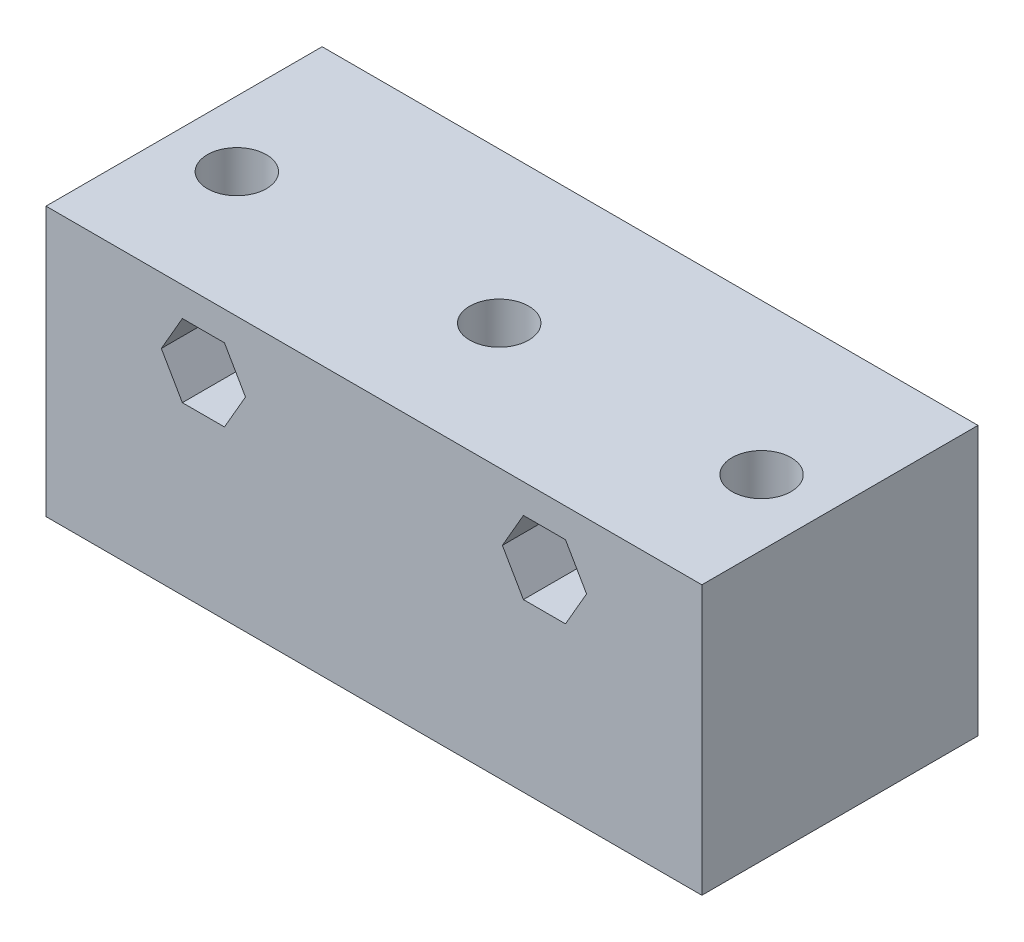
ISO-10303-21;
HEADER;
FILE_DESCRIPTION(('STEP AP214'),'2;1');
FILE_NAME('part.step','',(''),(''),'','','');
FILE_SCHEMA(('AUTOMOTIVE_DESIGN { 1 0 10303 214 1 1 1 1 }'));
ENDSEC;
DATA;
#1=APPLICATION_CONTEXT('core data for automotive mechanical design processes');
#2=APPLICATION_PROTOCOL_DEFINITION('international standard','automotive_design',2000,#1);
#3=PRODUCT_CONTEXT('',#1,'mechanical');
#4=PRODUCT('Part','Part','',(#3));
#5=PRODUCT_RELATED_PRODUCT_CATEGORY('part','',(#4));
#6=PRODUCT_DEFINITION_FORMATION('','',#4);
#7=PRODUCT_DEFINITION_CONTEXT('part definition',#1,'design');
#8=PRODUCT_DEFINITION('design','',#6,#7);
#9=PRODUCT_DEFINITION_SHAPE('','',#8);
#10=(LENGTH_UNIT() NAMED_UNIT(*) SI_UNIT(.MILLI.,.METRE.));
#11=(NAMED_UNIT(*) PLANE_ANGLE_UNIT() SI_UNIT($,.RADIAN.));
#12=(NAMED_UNIT(*) SI_UNIT($,.STERADIAN.) SOLID_ANGLE_UNIT());
#13=UNCERTAINTY_MEASURE_WITH_UNIT(LENGTH_MEASURE(1.E-05),#10,'distance_accuracy_value','');
#14=(GEOMETRIC_REPRESENTATION_CONTEXT(3) GLOBAL_UNCERTAINTY_ASSIGNED_CONTEXT((#13)) GLOBAL_UNIT_ASSIGNED_CONTEXT((#10,
#11,#12)) REPRESENTATION_CONTEXT('',''));
#15=CARTESIAN_POINT('',(0.,0.,0.));
#16=DIRECTION('',(0.,0.,1.));
#17=DIRECTION('',(1.,0.,0.));
#18=AXIS2_PLACEMENT_3D('',#15,#16,#17);
#19=CARTESIAN_POINT('',(8.85801933130078,5.11417984541329,42.1));
#20=DIRECTION('',(-0.866025403784444,-0.499999999999991,0.));
#21=DIRECTION('',(0.499999999999991,-0.866025403784444,0.));
#22=AXIS2_PLACEMENT_3D('',#19,#20,#21);
#23=PLANE('',#22);
#24=DIRECTION('',(0.,0.,-1.));
#25=VECTOR('',#24,1.);
#26=CARTESIAN_POINT('',(20.7920975668151,-15.55625,42.1));
#27=LINE('',#26,#25);
#28=CARTESIAN_POINT('',(20.7920975668151,-15.55625,42.1));
#29=VERTEX_POINT('',#28);
#30=CARTESIAN_POINT('',(20.7920975668151,-15.55625,10.));
#31=VERTEX_POINT('',#30);
#32=EDGE_CURVE('E277',#29,#31,#27,.T.);
#33=ORIENTED_EDGE('',*,*,#32,.T.);
#34=DIRECTION('',(-0.499999999999991,0.866025403784444,0.));
#35=VECTOR('',#34,1.);
#36=CARTESIAN_POINT('',(8.85801933130078,5.11417984541329,10.));
#37=LINE('',#36,#35);
#38=CARTESIAN_POINT('',(17.5841951336303,-10.,10.));
#39=VERTEX_POINT('',#38);
#40=EDGE_CURVE('E197',#31,#39,#37,.T.);
#41=ORIENTED_EDGE('',*,*,#40,.T.);
#42=DIRECTION('',(0.,0.,-1.));
#43=VECTOR('',#42,1.);
#44=CARTESIAN_POINT('',(17.5841951336303,-10.,42.1));
#45=LINE('',#44,#43);
#46=CARTESIAN_POINT('',(17.5841951336303,-10.,42.1));
#47=VERTEX_POINT('',#46);
#48=EDGE_CURVE('E11',#47,#39,#45,.T.);
#49=ORIENTED_EDGE('',*,*,#48,.F.);
#50=DIRECTION('',(-0.499999999999991,0.866025403784444,0.));
#51=VECTOR('',#50,1.);
#52=CARTESIAN_POINT('',(8.85801933130078,5.11417984541329,42.1));
#53=LINE('',#52,#51);
#54=EDGE_CURVE('E254',#29,#47,#53,.T.);
#55=ORIENTED_EDGE('',*,*,#54,.F.);
#56=EDGE_LOOP('',(#33,#41,#49,#55));
#57=FACE_BOUND('',#56,.T.);
#58=ADVANCED_FACE('F35',(#57),#23,.F.);
#59=CARTESIAN_POINT('',(17.5182733691451,-10.1141798454131,42.1));
#60=DIRECTION('',(-0.866025403784444,0.49999999999999,0.));
#61=DIRECTION('',(-0.49999999999999,-0.866025403784444,0.));
#62=AXIS2_PLACEMENT_3D('',#59,#60,#61);
#63=PLANE('',#62);
#64=ORIENTED_EDGE('',*,*,#48,.T.);
#65=DIRECTION('',(0.49999999999999,0.866025403784444,0.));
#66=VECTOR('',#65,1.);
#67=CARTESIAN_POINT('',(17.5182733691451,-10.1141798454131,10.));
#68=LINE('',#67,#66);
#69=CARTESIAN_POINT('',(20.7920975668151,-4.44374999999995,10.));
#70=VERTEX_POINT('',#69);
#71=EDGE_CURVE('E194',#39,#70,#68,.T.);
#72=ORIENTED_EDGE('',*,*,#71,.T.);
#73=DIRECTION('',(0.,0.,-1.));
#74=VECTOR('',#73,1.);
#75=CARTESIAN_POINT('',(20.7920975668151,-4.44374999999995,42.1));
#76=LINE('',#75,#74);
#77=CARTESIAN_POINT('',(20.7920975668151,-4.44374999999995,42.1));
#78=VERTEX_POINT('',#77);
#79=EDGE_CURVE('E44',#78,#70,#76,.T.);
#80=ORIENTED_EDGE('',*,*,#79,.F.);
#81=DIRECTION('',(0.49999999999999,0.866025403784444,0.));
#82=VECTOR('',#81,1.);
#83=CARTESIAN_POINT('',(17.5182733691451,-10.1141798454131,42.1));
#84=LINE('',#83,#82);
#85=EDGE_CURVE('E257',#47,#78,#84,.T.);
#86=ORIENTED_EDGE('',*,*,#85,.F.);
#87=EDGE_LOOP('',(#64,#72,#80,#86));
#88=FACE_BOUND('',#87,.T.);
#89=ADVANCED_FACE('F324',(#88),#63,.F.);
#90=CARTESIAN_POINT('',(0.,-4.44374999999995,42.1));
#91=DIRECTION('',(0.,1.,0.));
#92=DIRECTION('',(0.,0.,1.));
#93=AXIS2_PLACEMENT_3D('',#90,#91,#92);
#94=PLANE('',#93);
#95=ORIENTED_EDGE('',*,*,#79,.T.);
#96=DIRECTION('',(1.,0.,0.));
#97=VECTOR('',#96,1.);
#98=CARTESIAN_POINT('',(0.,-4.44374999999995,10.));
#99=LINE('',#98,#97);
#100=CARTESIAN_POINT('',(27.2079024331849,-4.44374999999995,10.));
#101=VERTEX_POINT('',#100);
#102=EDGE_CURVE('E191',#70,#101,#99,.T.);
#103=ORIENTED_EDGE('',*,*,#102,.T.);
#104=DIRECTION('',(0.,0.,-1.));
#105=VECTOR('',#104,1.);
#106=CARTESIAN_POINT('',(27.2079024331849,-4.44374999999995,42.1));
#107=LINE('',#106,#105);
#108=CARTESIAN_POINT('',(27.2079024331849,-4.44374999999995,42.1));
#109=VERTEX_POINT('',#108);
#110=EDGE_CURVE('E287',#109,#101,#107,.T.);
#111=ORIENTED_EDGE('',*,*,#110,.F.);
#112=DIRECTION('',(1.,0.,0.));
#113=VECTOR('',#112,1.);
#114=CARTESIAN_POINT('',(0.,-4.44374999999995,42.1));
#115=LINE('',#114,#113);
#116=EDGE_CURVE('E259',#78,#109,#115,.T.);
#117=ORIENTED_EDGE('',*,*,#116,.F.);
#118=EDGE_LOOP('',(#95,#103,#111,#117));
#119=FACE_BOUND('',#118,.T.);
#120=ADVANCED_FACE('F330',(#119),#94,.F.);
#121=CARTESIAN_POINT('',(18.4817266308554,10.6704298454132,42.1));
#122=DIRECTION('',(0.866025403784444,0.499999999999991,0.));
#123=DIRECTION('',(-0.499999999999991,0.866025403784444,0.));
#124=AXIS2_PLACEMENT_3D('',#121,#122,#123);
#125=PLANE('',#124);
#126=ORIENTED_EDGE('',*,*,#110,.T.);
#127=DIRECTION('',(0.499999999999991,-0.866025403784444,0.));
#128=VECTOR('',#127,1.);
#129=CARTESIAN_POINT('',(18.4817266308554,10.6704298454132,10.));
#130=LINE('',#129,#128);
#131=CARTESIAN_POINT('',(30.4158048663697,-10.,10.));
#132=VERTEX_POINT('',#131);
#133=EDGE_CURVE('E188',#101,#132,#130,.T.);
#134=ORIENTED_EDGE('',*,*,#133,.T.);
#135=DIRECTION('',(0.,0.,-1.));
#136=VECTOR('',#135,1.);
#137=CARTESIAN_POINT('',(30.4158048663697,-10.,42.1));
#138=LINE('',#137,#136);
#139=CARTESIAN_POINT('',(30.4158048663697,-10.,42.1));
#140=VERTEX_POINT('',#139);
#141=EDGE_CURVE('E284',#140,#132,#138,.T.);
#142=ORIENTED_EDGE('',*,*,#141,.F.);
#143=DIRECTION('',(0.499999999999991,-0.866025403784444,0.));
#144=VECTOR('',#143,1.);
#145=CARTESIAN_POINT('',(18.4817266308554,10.6704298454132,42.1));
#146=LINE('',#145,#144);
#147=EDGE_CURVE('E261',#109,#140,#146,.T.);
#148=ORIENTED_EDGE('',*,*,#147,.F.);
#149=EDGE_LOOP('',(#126,#134,#142,#148));
#150=FACE_BOUND('',#149,.T.);
#151=ADVANCED_FACE('F389',(#150),#125,.F.);
#152=CARTESIAN_POINT('',(27.1419806686997,-15.670429845413,42.1));
#153=DIRECTION('',(0.866025403784444,-0.499999999999991,0.));
#154=DIRECTION('',(0.499999999999991,0.866025403784444,0.));
#155=AXIS2_PLACEMENT_3D('',#152,#153,#154);
#156=PLANE('',#155);
#157=ORIENTED_EDGE('',*,*,#141,.T.);
#158=DIRECTION('',(-0.499999999999991,-0.866025403784444,0.));
#159=VECTOR('',#158,1.);
#160=CARTESIAN_POINT('',(27.1419806686997,-15.670429845413,10.));
#161=LINE('',#160,#159);
#162=CARTESIAN_POINT('',(27.2079024331849,-15.55625,10.));
#163=VERTEX_POINT('',#162);
#164=EDGE_CURVE('E185',#132,#163,#161,.T.);
#165=ORIENTED_EDGE('',*,*,#164,.T.);
#166=DIRECTION('',(0.,0.,-1.));
#167=VECTOR('',#166,1.);
#168=CARTESIAN_POINT('',(27.2079024331849,-15.55625,42.1));
#169=LINE('',#168,#167);
#170=CARTESIAN_POINT('',(27.2079024331849,-15.55625,42.1));
#171=VERTEX_POINT('',#170);
#172=EDGE_CURVE('E280',#171,#163,#169,.T.);
#173=ORIENTED_EDGE('',*,*,#172,.F.);
#174=DIRECTION('',(-0.499999999999991,-0.866025403784444,0.));
#175=VECTOR('',#174,1.);
#176=CARTESIAN_POINT('',(27.1419806686997,-15.670429845413,42.1));
#177=LINE('',#176,#175);
#178=EDGE_CURVE('E263',#140,#171,#177,.T.);
#179=ORIENTED_EDGE('',*,*,#178,.F.);
#180=EDGE_LOOP('',(#157,#165,#173,#179));
#181=FACE_BOUND('',#180,.T.);
#182=ADVANCED_FACE('F350',(#181),#156,.F.);
#183=CARTESIAN_POINT('',(100.,0.,42.1));
#184=DIRECTION('',(1.,0.,0.));
#185=DIRECTION('',(0.,0.,-1.));
#186=AXIS2_PLACEMENT_3D('',#183,#184,#185);
#187=PLANE('',#186);
#188=DIRECTION('',(0.,-1.,0.));
#189=VECTOR('',#188,1.);
#190=CARTESIAN_POINT('',(100.,0.,0.));
#191=LINE('',#190,#189);
#192=CARTESIAN_POINT('',(100.,0.,0.));
#193=VERTEX_POINT('',#192);
#194=CARTESIAN_POINT('',(100.,-41.,0.));
#195=VERTEX_POINT('',#194);
#196=EDGE_CURVE('E216',#193,#195,#191,.T.);
#197=ORIENTED_EDGE('',*,*,#196,.F.);
#198=DIRECTION('',(0.,0.,-1.));
#199=VECTOR('',#198,1.);
#200=CARTESIAN_POINT('',(100.,0.,42.1));
#201=LINE('',#200,#199);
#202=CARTESIAN_POINT('',(100.,0.,42.1));
#203=VERTEX_POINT('',#202);
#204=EDGE_CURVE('E281',#203,#193,#201,.T.);
#205=ORIENTED_EDGE('',*,*,#204,.F.);
#206=DIRECTION('',(0.,-1.,0.));
#207=VECTOR('',#206,1.);
#208=CARTESIAN_POINT('',(100.,0.,42.1));
#209=LINE('',#208,#207);
#210=CARTESIAN_POINT('',(100.,-41.,42.1));
#211=VERTEX_POINT('',#210);
#212=EDGE_CURVE('E243',#203,#211,#209,.T.);
#213=ORIENTED_EDGE('',*,*,#212,.T.);
#214=DIRECTION('',(0.,0.,-1.));
#215=VECTOR('',#214,1.);
#216=CARTESIAN_POINT('',(100.,-41.,42.1));
#217=LINE('',#216,#215);
#218=EDGE_CURVE('E292',#211,#195,#217,.T.);
#219=ORIENTED_EDGE('',*,*,#218,.T.);
#220=EDGE_LOOP('',(#197,#205,#213,#219));
#221=FACE_BOUND('',#220,.T.);
#222=ADVANCED_FACE('F346',(#221),#187,.T.);
#223=CARTESIAN_POINT('',(0.,0.,42.1));
#224=DIRECTION('',(0.,1.,0.));
#225=DIRECTION('',(0.,0.,1.));
#226=AXIS2_PLACEMENT_3D('',#223,#224,#225);
#227=PLANE('',#226);
#228=CARTESIAN_POINT('',(9.99999999999999,0.,23.));
#229=DIRECTION('',(0.,-1.,0.));
#230=DIRECTION('',(0.,0.,-1.));
#231=AXIS2_PLACEMENT_3D('',#228,#229,#230);
#232=CIRCLE('',#231,4.5);
#233=CARTESIAN_POINT('',(9.99999999999999,0.,18.5));
#234=VERTEX_POINT('',#233);
#235=EDGE_CURVE('E209',#234,#234,#232,.T.);
#236=ORIENTED_EDGE('',*,*,#235,.T.);
#237=EDGE_LOOP('',(#236));
#238=FACE_BOUND('',#237,.T.);
#239=CARTESIAN_POINT('',(50.,0.,23.));
#240=DIRECTION('',(0.,-1.,0.));
#241=DIRECTION('',(0.,0.,-1.));
#242=AXIS2_PLACEMENT_3D('',#239,#240,#241);
#243=CIRCLE('',#242,4.5);
#244=CARTESIAN_POINT('',(50.,0.,18.5));
#245=VERTEX_POINT('',#244);
#246=EDGE_CURVE('E217',#245,#245,#243,.T.);
#247=ORIENTED_EDGE('',*,*,#246,.T.);
#248=EDGE_LOOP('',(#247));
#249=FACE_BOUND('',#248,.T.);
#250=CARTESIAN_POINT('',(90.,0.,23.));
#251=DIRECTION('',(0.,-1.,0.));
#252=DIRECTION('',(0.,0.,-1.));
#253=AXIS2_PLACEMENT_3D('',#250,#251,#252);
#254=CIRCLE('',#253,4.5);
#255=CARTESIAN_POINT('',(90.,0.,18.5));
#256=VERTEX_POINT('',#255);
#257=EDGE_CURVE('E206',#256,#256,#254,.T.);
#258=ORIENTED_EDGE('',*,*,#257,.T.);
#259=EDGE_LOOP('',(#258));
#260=FACE_BOUND('',#259,.T.);
#261=DIRECTION('',(1.,0.,0.));
#262=VECTOR('',#261,1.);
#263=CARTESIAN_POINT('',(0.,0.,0.));
#264=LINE('',#263,#262);
#265=CARTESIAN_POINT('',(0.,0.,0.));
#266=VERTEX_POINT('',#265);
#267=EDGE_CURVE('E269',#266,#193,#264,.T.);
#268=ORIENTED_EDGE('',*,*,#267,.F.);
#269=DIRECTION('',(0.,0.,-1.));
#270=VECTOR('',#269,1.);
#271=CARTESIAN_POINT('',(0.,0.,42.1));
#272=LINE('',#271,#270);
#273=CARTESIAN_POINT('',(0.,0.,42.1));
#274=VERTEX_POINT('',#273);
#275=EDGE_CURVE('E297',#274,#266,#272,.T.);
#276=ORIENTED_EDGE('',*,*,#275,.F.);
#277=DIRECTION('',(1.,0.,0.));
#278=VECTOR('',#277,1.);
#279=CARTESIAN_POINT('',(0.,0.,42.1));
#280=LINE('',#279,#278);
#281=EDGE_CURVE('E246',#274,#203,#280,.T.);
#282=ORIENTED_EDGE('',*,*,#281,.T.);
#283=ORIENTED_EDGE('',*,*,#204,.T.);
#284=EDGE_LOOP('',(#268,#276,#282,#283));
#285=FACE_BOUND('',#284,.T.);
#286=ADVANCED_FACE('F342',(#238,#249,#260,#285),#227,.T.);
#287=CARTESIAN_POINT('',(0.,0.,42.1));
#288=DIRECTION('',(1.,0.,0.));
#289=DIRECTION('',(0.,0.,-1.));
#290=AXIS2_PLACEMENT_3D('',#287,#288,#289);
#291=PLANE('',#290);
#292=DIRECTION('',(0.,-1.,0.));
#293=VECTOR('',#292,1.);
#294=CARTESIAN_POINT('',(0.,0.,0.));
#295=LINE('',#294,#293);
#296=CARTESIAN_POINT('',(0.,-41.,0.));
#297=VERTEX_POINT('',#296);
#298=EDGE_CURVE('E272',#266,#297,#295,.T.);
#299=ORIENTED_EDGE('',*,*,#298,.T.);
#300=DIRECTION('',(0.,0.,-1.));
#301=VECTOR('',#300,1.);
#302=CARTESIAN_POINT('',(0.,-41.,42.1));
#303=LINE('',#302,#301);
#304=CARTESIAN_POINT('',(0.,-41.,42.1));
#305=VERTEX_POINT('',#304);
#306=EDGE_CURVE('E294',#305,#297,#303,.T.);
#307=ORIENTED_EDGE('',*,*,#306,.F.);
#308=DIRECTION('',(0.,-1.,0.));
#309=VECTOR('',#308,1.);
#310=CARTESIAN_POINT('',(0.,0.,42.1));
#311=LINE('',#310,#309);
#312=EDGE_CURVE('E249',#274,#305,#311,.T.);
#313=ORIENTED_EDGE('',*,*,#312,.F.);
#314=ORIENTED_EDGE('',*,*,#275,.T.);
#315=EDGE_LOOP('',(#299,#307,#313,#314));
#316=FACE_BOUND('',#315,.T.);
#317=ADVANCED_FACE('F339',(#316),#291,.F.);
#318=CARTESIAN_POINT('',(0.,-4.44374999999995,42.1));
#319=DIRECTION('',(0.,-1.,0.));
#320=DIRECTION('',(0.,0.,-1.));
#321=AXIS2_PLACEMENT_3D('',#318,#319,#320);
#322=PLANE('',#321);
#323=DIRECTION('',(-1.,0.,0.));
#324=VECTOR('',#323,1.);
#325=CARTESIAN_POINT('',(0.,-4.44374999999995,10.));
#326=LINE('',#325,#324);
#327=CARTESIAN_POINT('',(79.2079024331849,-4.44374999999995,10.));
#328=VERTEX_POINT('',#327);
#329=CARTESIAN_POINT('',(72.7920975668151,-4.44374999999995,10.));
#330=VERTEX_POINT('',#329);
#331=EDGE_CURVE('E52',#328,#330,#326,.T.);
#332=ORIENTED_EDGE('',*,*,#331,.F.);
#333=DIRECTION('',(0.,0.,-1.));
#334=VECTOR('',#333,1.);
#335=CARTESIAN_POINT('',(79.2079024331849,-4.44374999999995,42.1));
#336=LINE('',#335,#334);
#337=CARTESIAN_POINT('',(79.2079024331849,-4.44374999999995,42.1));
#338=VERTEX_POINT('',#337);
#339=EDGE_CURVE('E39',#338,#328,#336,.T.);
#340=ORIENTED_EDGE('',*,*,#339,.F.);
#341=DIRECTION('',(-1.,0.,0.));
#342=VECTOR('',#341,1.);
#343=CARTESIAN_POINT('',(0.,-4.44374999999995,42.1));
#344=LINE('',#343,#342);
#345=CARTESIAN_POINT('',(72.7920975668151,-4.44374999999995,42.1));
#346=VERTEX_POINT('',#345);
#347=EDGE_CURVE('E227',#338,#346,#344,.T.);
#348=ORIENTED_EDGE('',*,*,#347,.T.);
#349=DIRECTION('',(0.,0.,-1.));
#350=VECTOR('',#349,1.);
#351=CARTESIAN_POINT('',(72.7920975668151,-4.44374999999995,42.1));
#352=LINE('',#351,#350);
#353=EDGE_CURVE('E161',#346,#330,#352,.T.);
#354=ORIENTED_EDGE('',*,*,#353,.T.);
#355=EDGE_LOOP('',(#332,#340,#348,#354));
#356=FACE_BOUND('',#355,.T.);
#357=ADVANCED_FACE('F37',(#356),#322,.T.);
#358=CARTESIAN_POINT('',(57.4817266308559,33.1870903438083,42.1));
#359=DIRECTION('',(-0.866025403784444,-0.49999999999999,0.));
#360=DIRECTION('',(0.49999999999999,-0.866025403784444,0.));
#361=AXIS2_PLACEMENT_3D('',#358,#359,#360);
#362=PLANE('',#361);
#363=DIRECTION('',(-0.49999999999999,0.866025403784444,0.));
#364=VECTOR('',#363,1.);
#365=CARTESIAN_POINT('',(57.4817266308559,33.1870903438083,10.));
#366=LINE('',#365,#364);
#367=CARTESIAN_POINT('',(82.4158048663697,-9.99999999999999,10.));
#368=VERTEX_POINT('',#367);
#369=EDGE_CURVE('E59',#368,#328,#366,.T.);
#370=ORIENTED_EDGE('',*,*,#369,.F.);
#371=DIRECTION('',(0.,0.,-1.));
#372=VECTOR('',#371,1.);
#373=CARTESIAN_POINT('',(82.4158048663697,-9.99999999999999,42.1));
#374=LINE('',#373,#372);
#375=CARTESIAN_POINT('',(82.4158048663697,-9.99999999999999,42.1));
#376=VERTEX_POINT('',#375);
#377=EDGE_CURVE('E304',#376,#368,#374,.T.);
#378=ORIENTED_EDGE('',*,*,#377,.F.);
#379=DIRECTION('',(-0.49999999999999,0.866025403784444,0.));
#380=VECTOR('',#379,1.);
#381=CARTESIAN_POINT('',(57.4817266308559,33.1870903438083,42.1));
#382=LINE('',#381,#380);
#383=EDGE_CURVE('E230',#376,#338,#382,.T.);
#384=ORIENTED_EDGE('',*,*,#383,.T.);
#385=ORIENTED_EDGE('',*,*,#339,.T.);
#386=EDGE_LOOP('',(#370,#378,#384,#385));
#387=FACE_BOUND('',#386,.T.);
#388=ADVANCED_FACE('F306',(#387),#362,.T.);
#389=CARTESIAN_POINT('',(66.1419806687002,-38.1870903438081,42.1));
#390=DIRECTION('',(-0.866025403784444,0.499999999999991,0.));
#391=DIRECTION('',(-0.499999999999991,-0.866025403784444,0.));
#392=AXIS2_PLACEMENT_3D('',#389,#390,#391);
#393=PLANE('',#392);
#394=DIRECTION('',(0.499999999999991,0.866025403784444,0.));
#395=VECTOR('',#394,1.);
#396=CARTESIAN_POINT('',(66.1419806687002,-38.1870903438081,10.));
#397=LINE('',#396,#395);
#398=CARTESIAN_POINT('',(79.2079024331848,-15.55625,10.));
#399=VERTEX_POINT('',#398);
#400=EDGE_CURVE('E177',#399,#368,#397,.T.);
#401=ORIENTED_EDGE('',*,*,#400,.F.);
#402=DIRECTION('',(0.,0.,-1.));
#403=VECTOR('',#402,1.);
#404=CARTESIAN_POINT('',(79.2079024331848,-15.55625,42.1));
#405=LINE('',#404,#403);
#406=CARTESIAN_POINT('',(79.2079024331848,-15.55625,42.1));
#407=VERTEX_POINT('',#406);
#408=EDGE_CURVE('E302',#407,#399,#405,.T.);
#409=ORIENTED_EDGE('',*,*,#408,.F.);
#410=DIRECTION('',(0.499999999999991,0.866025403784444,0.));
#411=VECTOR('',#410,1.);
#412=CARTESIAN_POINT('',(66.1419806687002,-38.1870903438081,42.1));
#413=LINE('',#412,#411);
#414=EDGE_CURVE('E234',#407,#376,#413,.T.);
#415=ORIENTED_EDGE('',*,*,#414,.T.);
#416=ORIENTED_EDGE('',*,*,#377,.T.);
#417=EDGE_LOOP('',(#401,#409,#415,#416));
#418=FACE_BOUND('',#417,.T.);
#419=ADVANCED_FACE('F360',(#418),#393,.T.);
#420=CARTESIAN_POINT('',(0.,-15.55625,42.1));
#421=DIRECTION('',(0.,1.,0.));
#422=DIRECTION('',(0.,0.,1.));
#423=AXIS2_PLACEMENT_3D('',#420,#421,#422);
#424=PLANE('',#423);
#425=DIRECTION('',(1.,0.,0.));
#426=VECTOR('',#425,1.);
#427=CARTESIAN_POINT('',(0.,-15.55625,10.));
#428=LINE('',#427,#426);
#429=CARTESIAN_POINT('',(72.7920975668151,-15.55625,10.));
#430=VERTEX_POINT('',#429);
#431=EDGE_CURVE('E169',#430,#399,#428,.T.);
#432=ORIENTED_EDGE('',*,*,#431,.F.);
#433=DIRECTION('',(0.,0.,-1.));
#434=VECTOR('',#433,1.);
#435=CARTESIAN_POINT('',(72.7920975668151,-15.55625,42.1));
#436=LINE('',#435,#434);
#437=CARTESIAN_POINT('',(72.7920975668151,-15.55625,42.1));
#438=VERTEX_POINT('',#437);
#439=EDGE_CURVE('E160',#438,#430,#436,.T.);
#440=ORIENTED_EDGE('',*,*,#439,.F.);
#441=DIRECTION('',(1.,0.,0.));
#442=VECTOR('',#441,1.);
#443=CARTESIAN_POINT('',(0.,-15.55625,42.1));
#444=LINE('',#443,#442);
#445=EDGE_CURVE('E237',#438,#407,#444,.T.);
#446=ORIENTED_EDGE('',*,*,#445,.T.);
#447=ORIENTED_EDGE('',*,*,#408,.T.);
#448=EDGE_LOOP('',(#432,#440,#446,#447));
#449=FACE_BOUND('',#448,.T.);
#450=ADVANCED_FACE('F357',(#449),#424,.T.);
#451=CARTESIAN_POINT('',(47.8580193313012,27.6308403438084,42.1));
#452=DIRECTION('',(0.866025403784444,0.499999999999991,0.));
#453=DIRECTION('',(-0.499999999999991,0.866025403784444,0.));
#454=AXIS2_PLACEMENT_3D('',#451,#452,#453);
#455=PLANE('',#454);
#456=DIRECTION('',(0.499999999999991,-0.866025403784444,0.));
#457=VECTOR('',#456,1.);
#458=CARTESIAN_POINT('',(47.8580193313012,27.6308403438084,10.));
#459=LINE('',#458,#457);
#460=CARTESIAN_POINT('',(69.5841951336303,-10.,10.));
#461=VERTEX_POINT('',#460);
#462=EDGE_CURVE('E165',#461,#430,#459,.T.);
#463=ORIENTED_EDGE('',*,*,#462,.F.);
#464=DIRECTION('',(0.,0.,-1.));
#465=VECTOR('',#464,1.);
#466=CARTESIAN_POINT('',(69.5841951336303,-10.,42.1));
#467=LINE('',#466,#465);
#468=CARTESIAN_POINT('',(69.5841951336303,-10.,42.1));
#469=VERTEX_POINT('',#468);
#470=EDGE_CURVE('E150',#469,#461,#467,.T.);
#471=ORIENTED_EDGE('',*,*,#470,.F.);
#472=DIRECTION('',(0.499999999999991,-0.866025403784444,0.));
#473=VECTOR('',#472,1.);
#474=CARTESIAN_POINT('',(47.8580193313012,27.6308403438084,42.1));
#475=LINE('',#474,#473);
#476=EDGE_CURVE('E240',#469,#438,#475,.T.);
#477=ORIENTED_EDGE('',*,*,#476,.T.);
#478=ORIENTED_EDGE('',*,*,#439,.T.);
#479=EDGE_LOOP('',(#463,#471,#477,#478));
#480=FACE_BOUND('',#479,.T.);
#481=ADVANCED_FACE('F166',(#480),#455,.T.);
#482=CARTESIAN_POINT('',(0.,-41.,42.1));
#483=DIRECTION('',(0.,1.,0.));
#484=DIRECTION('',(0.,0.,1.));
#485=AXIS2_PLACEMENT_3D('',#482,#483,#484);
#486=PLANE('',#485);
#487=CARTESIAN_POINT('',(9.99999999999999,-41.,23.));
#488=DIRECTION('',(0.,1.,0.));
#489=DIRECTION('',(0.,0.,1.));
#490=AXIS2_PLACEMENT_3D('',#487,#488,#489);
#491=CIRCLE('',#490,4.5);
#492=CARTESIAN_POINT('',(9.99999999999999,-41.,27.5));
#493=VERTEX_POINT('',#492);
#494=EDGE_CURVE('E212',#493,#493,#491,.T.);
#495=ORIENTED_EDGE('',*,*,#494,.T.);
#496=EDGE_LOOP('',(#495));
#497=FACE_BOUND('',#496,.T.);
#498=CARTESIAN_POINT('',(50.,-41.,23.));
#499=DIRECTION('',(0.,1.,0.));
#500=DIRECTION('',(0.,0.,1.));
#501=AXIS2_PLACEMENT_3D('',#498,#499,#500);
#502=CIRCLE('',#501,4.5);
#503=CARTESIAN_POINT('',(50.,-41.,27.5));
#504=VERTEX_POINT('',#503);
#505=EDGE_CURVE('E213',#504,#504,#502,.T.);
#506=ORIENTED_EDGE('',*,*,#505,.T.);
#507=EDGE_LOOP('',(#506));
#508=FACE_BOUND('',#507,.T.);
#509=CARTESIAN_POINT('',(90.,-41.,23.));
#510=DIRECTION('',(0.,1.,0.));
#511=DIRECTION('',(0.,0.,1.));
#512=AXIS2_PLACEMENT_3D('',#509,#510,#511);
#513=CIRCLE('',#512,4.5);
#514=CARTESIAN_POINT('',(90.,-41.,27.5));
#515=VERTEX_POINT('',#514);
#516=EDGE_CURVE('E220',#515,#515,#513,.T.);
#517=ORIENTED_EDGE('',*,*,#516,.T.);
#518=EDGE_LOOP('',(#517));
#519=FACE_BOUND('',#518,.T.);
#520=DIRECTION('',(1.,0.,0.));
#521=VECTOR('',#520,1.);
#522=CARTESIAN_POINT('',(0.,-41.,0.));
#523=LINE('',#522,#521);
#524=EDGE_CURVE('E231',#297,#195,#523,.T.);
#525=ORIENTED_EDGE('',*,*,#524,.T.);
#526=ORIENTED_EDGE('',*,*,#218,.F.);
#527=DIRECTION('',(1.,0.,0.));
#528=VECTOR('',#527,1.);
#529=CARTESIAN_POINT('',(0.,-41.,42.1));
#530=LINE('',#529,#528);
#531=EDGE_CURVE('E252',#305,#211,#530,.T.);
#532=ORIENTED_EDGE('',*,*,#531,.F.);
#533=ORIENTED_EDGE('',*,*,#306,.T.);
#534=EDGE_LOOP('',(#525,#526,#532,#533));
#535=FACE_BOUND('',#534,.T.);
#536=ADVANCED_FACE('F335',(#497,#508,#519,#535),#486,.F.);
#537=CARTESIAN_POINT('',(56.5182733691455,-32.6308403438082,42.1));
#538=DIRECTION('',(0.866025403784444,-0.49999999999999,0.));
#539=DIRECTION('',(0.49999999999999,0.866025403784444,0.));
#540=AXIS2_PLACEMENT_3D('',#537,#538,#539);
#541=PLANE('',#540);
#542=DIRECTION('',(-0.49999999999999,-0.866025403784444,0.));
#543=VECTOR('',#542,1.);
#544=CARTESIAN_POINT('',(56.5182733691455,-32.6308403438082,10.));
#545=LINE('',#544,#543);
#546=EDGE_CURVE('E154',#330,#461,#545,.T.);
#547=ORIENTED_EDGE('',*,*,#546,.F.);
#548=ORIENTED_EDGE('',*,*,#353,.F.);
#549=DIRECTION('',(-0.49999999999999,-0.866025403784444,0.));
#550=VECTOR('',#549,1.);
#551=CARTESIAN_POINT('',(56.5182733691455,-32.6308403438082,42.1));
#552=LINE('',#551,#550);
#553=EDGE_CURVE('E156',#346,#469,#552,.T.);
#554=ORIENTED_EDGE('',*,*,#553,.T.);
#555=ORIENTED_EDGE('',*,*,#470,.T.);
#556=EDGE_LOOP('',(#547,#548,#554,#555));
#557=FACE_BOUND('',#556,.T.);
#558=ADVANCED_FACE('F152',(#557),#541,.T.);
#559=CARTESIAN_POINT('',(0.,-15.55625,42.1));
#560=DIRECTION('',(0.,-1.,0.));
#561=DIRECTION('',(0.,0.,-1.));
#562=AXIS2_PLACEMENT_3D('',#559,#560,#561);
#563=PLANE('',#562);
#564=ORIENTED_EDGE('',*,*,#172,.T.);
#565=DIRECTION('',(-1.,0.,0.));
#566=VECTOR('',#565,1.);
#567=CARTESIAN_POINT('',(0.,-15.55625,10.));
#568=LINE('',#567,#566);
#569=EDGE_CURVE('E200',#163,#31,#568,.T.);
#570=ORIENTED_EDGE('',*,*,#569,.T.);
#571=ORIENTED_EDGE('',*,*,#32,.F.);
#572=DIRECTION('',(-1.,0.,0.));
#573=VECTOR('',#572,1.);
#574=CARTESIAN_POINT('',(0.,-15.55625,42.1));
#575=LINE('',#574,#573);
#576=EDGE_CURVE('E265',#171,#29,#575,.T.);
#577=ORIENTED_EDGE('',*,*,#576,.F.);
#578=EDGE_LOOP('',(#564,#570,#571,#577));
#579=FACE_BOUND('',#578,.T.);
#580=ADVANCED_FACE('F354',(#579),#563,.F.);
#581=CARTESIAN_POINT('',(0.,0.,42.1));
#582=DIRECTION('',(0.,0.,1.));
#583=DIRECTION('',(1.,0.,0.));
#584=AXIS2_PLACEMENT_3D('',#581,#582,#583);
#585=PLANE('',#584);
#586=ORIENTED_EDGE('',*,*,#347,.F.);
#587=ORIENTED_EDGE('',*,*,#383,.F.);
#588=ORIENTED_EDGE('',*,*,#414,.F.);
#589=ORIENTED_EDGE('',*,*,#445,.F.);
#590=ORIENTED_EDGE('',*,*,#476,.F.);
#591=ORIENTED_EDGE('',*,*,#553,.F.);
#592=EDGE_LOOP('',(#586,#587,#588,#589,#590,#591));
#593=FACE_BOUND('',#592,.T.);
#594=ORIENTED_EDGE('',*,*,#212,.F.);
#595=ORIENTED_EDGE('',*,*,#281,.F.);
#596=ORIENTED_EDGE('',*,*,#312,.T.);
#597=ORIENTED_EDGE('',*,*,#531,.T.);
#598=EDGE_LOOP('',(#594,#595,#596,#597));
#599=FACE_BOUND('',#598,.T.);
#600=ORIENTED_EDGE('',*,*,#54,.T.);
#601=ORIENTED_EDGE('',*,*,#85,.T.);
#602=ORIENTED_EDGE('',*,*,#116,.T.);
#603=ORIENTED_EDGE('',*,*,#147,.T.);
#604=ORIENTED_EDGE('',*,*,#178,.T.);
#605=ORIENTED_EDGE('',*,*,#576,.T.);
#606=EDGE_LOOP('',(#600,#601,#602,#603,#604,#605));
#607=FACE_BOUND('',#606,.T.);
#608=ADVANCED_FACE('F468',(#593,#599,#607),#585,.T.);
#609=CARTESIAN_POINT('',(0.,0.,0.));
#610=DIRECTION('',(0.,0.,1.));
#611=DIRECTION('',(1.,0.,0.));
#612=AXIS2_PLACEMENT_3D('',#609,#610,#611);
#613=PLANE('',#612);
#614=ORIENTED_EDGE('',*,*,#196,.T.);
#615=ORIENTED_EDGE('',*,*,#524,.F.);
#616=ORIENTED_EDGE('',*,*,#298,.F.);
#617=ORIENTED_EDGE('',*,*,#267,.T.);
#618=EDGE_LOOP('',(#614,#615,#616,#617));
#619=FACE_BOUND('',#618,.T.);
#620=CARTESIAN_POINT('',(24.,-10.,0.));
#621=DIRECTION('',(0.,0.,1.));
#622=DIRECTION('',(1.,0.,0.));
#623=AXIS2_PLACEMENT_3D('',#620,#621,#622);
#624=CIRCLE('',#623,4.5);
#625=CARTESIAN_POINT('',(28.5,-10.,0.));
#626=VERTEX_POINT('',#625);
#627=EDGE_CURVE('E180',#626,#626,#624,.T.);
#628=ORIENTED_EDGE('',*,*,#627,.T.);
#629=EDGE_LOOP('',(#628));
#630=FACE_BOUND('',#629,.T.);
#631=CARTESIAN_POINT('',(76.,-10.,0.));
#632=DIRECTION('',(0.,0.,1.));
#633=DIRECTION('',(1.,0.,0.));
#634=AXIS2_PLACEMENT_3D('',#631,#632,#633);
#635=CIRCLE('',#634,4.5);
#636=CARTESIAN_POINT('',(80.5,-10.,0.));
#637=VERTEX_POINT('',#636);
#638=EDGE_CURVE('E181',#637,#637,#635,.T.);
#639=ORIENTED_EDGE('',*,*,#638,.T.);
#640=EDGE_LOOP('',(#639));
#641=FACE_BOUND('',#640,.T.);
#642=ADVANCED_FACE('F444',(#619,#630,#641),#613,.F.);
#643=CARTESIAN_POINT('',(90.,-53.7279220613579,23.));
#644=DIRECTION('',(0.,1.,0.));
#645=DIRECTION('',(0.,0.,1.));
#646=AXIS2_PLACEMENT_3D('',#643,#644,#645);
#647=CYLINDRICAL_SURFACE('',#646,4.5);
#648=ORIENTED_EDGE('',*,*,#516,.F.);
#649=EDGE_LOOP('',(#648));
#650=FACE_BOUND('',#649,.T.);
#651=ORIENTED_EDGE('',*,*,#257,.F.);
#652=EDGE_LOOP('',(#651));
#653=FACE_BOUND('',#652,.T.);
#654=ADVANCED_FACE('F435',(#650,#653),#647,.F.);
#655=CARTESIAN_POINT('',(50.,-53.7279220613579,23.));
#656=DIRECTION('',(0.,1.,0.));
#657=DIRECTION('',(0.,0.,1.));
#658=AXIS2_PLACEMENT_3D('',#655,#656,#657);
#659=CYLINDRICAL_SURFACE('',#658,4.5);
#660=ORIENTED_EDGE('',*,*,#505,.F.);
#661=EDGE_LOOP('',(#660));
#662=FACE_BOUND('',#661,.T.);
#663=ORIENTED_EDGE('',*,*,#246,.F.);
#664=EDGE_LOOP('',(#663));
#665=FACE_BOUND('',#664,.T.);
#666=ADVANCED_FACE('F423',(#662,#665),#659,.F.);
#667=CARTESIAN_POINT('',(9.99999999999999,-53.7279220613579,23.));
#668=DIRECTION('',(0.,1.,0.));
#669=DIRECTION('',(0.,0.,1.));
#670=AXIS2_PLACEMENT_3D('',#667,#668,#669);
#671=CYLINDRICAL_SURFACE('',#670,4.5);
#672=ORIENTED_EDGE('',*,*,#494,.F.);
#673=EDGE_LOOP('',(#672));
#674=FACE_BOUND('',#673,.T.);
#675=ORIENTED_EDGE('',*,*,#235,.F.);
#676=EDGE_LOOP('',(#675));
#677=FACE_BOUND('',#676,.T.);
#678=ADVANCED_FACE('F417',(#674,#677),#671,.F.);
#679=CARTESIAN_POINT('',(24.,-10.,10.));
#680=DIRECTION('',(0.,0.,-1.));
#681=DIRECTION('',(-1.,0.,0.));
#682=AXIS2_PLACEMENT_3D('',#679,#680,#681);
#683=CYLINDRICAL_SURFACE('',#682,4.5);
#684=CARTESIAN_POINT('',(24.,-10.,10.));
#685=DIRECTION('',(0.,0.,1.));
#686=DIRECTION('',(1.,0.,0.));
#687=AXIS2_PLACEMENT_3D('',#684,#685,#686);
#688=CIRCLE('',#687,4.5);
#689=CARTESIAN_POINT('',(28.5,-10.,10.));
#690=VERTEX_POINT('',#689);
#691=EDGE_CURVE('E203',#690,#690,#688,.T.);
#692=ORIENTED_EDGE('',*,*,#691,.T.);
#693=EDGE_LOOP('',(#692));
#694=FACE_BOUND('',#693,.T.);
#695=ORIENTED_EDGE('',*,*,#627,.F.);
#696=EDGE_LOOP('',(#695));
#697=FACE_BOUND('',#696,.T.);
#698=ADVANCED_FACE('F422',(#694,#697),#683,.F.);
#699=CARTESIAN_POINT('',(0.,0.,10.));
#700=DIRECTION('',(0.,0.,1.));
#701=DIRECTION('',(1.,0.,0.));
#702=AXIS2_PLACEMENT_3D('',#699,#700,#701);
#703=PLANE('',#702);
#704=ORIENTED_EDGE('',*,*,#164,.F.);
#705=ORIENTED_EDGE('',*,*,#133,.F.);
#706=ORIENTED_EDGE('',*,*,#102,.F.);
#707=ORIENTED_EDGE('',*,*,#71,.F.);
#708=ORIENTED_EDGE('',*,*,#40,.F.);
#709=ORIENTED_EDGE('',*,*,#569,.F.);
#710=EDGE_LOOP('',(#704,#705,#706,#707,#708,#709));
#711=FACE_BOUND('',#710,.T.);
#712=ORIENTED_EDGE('',*,*,#691,.F.);
#713=EDGE_LOOP('',(#712));
#714=FACE_BOUND('',#713,.T.);
#715=ADVANCED_FACE('F321',(#711,#714),#703,.T.);
#716=CARTESIAN_POINT('',(76.,-10.,10.));
#717=DIRECTION('',(0.,0.,-1.));
#718=DIRECTION('',(-1.,0.,0.));
#719=AXIS2_PLACEMENT_3D('',#716,#717,#718);
#720=CYLINDRICAL_SURFACE('',#719,4.5);
#721=CARTESIAN_POINT('',(76.,-10.,10.));
#722=DIRECTION('',(0.,0.,1.));
#723=DIRECTION('',(1.,0.,0.));
#724=AXIS2_PLACEMENT_3D('',#721,#722,#723);
#725=CIRCLE('',#724,4.5);
#726=CARTESIAN_POINT('',(80.5,-10.,10.));
#727=VERTEX_POINT('',#726);
#728=EDGE_CURVE('E184',#727,#727,#725,.T.);
#729=ORIENTED_EDGE('',*,*,#728,.T.);
#730=EDGE_LOOP('',(#729));
#731=FACE_BOUND('',#730,.T.);
#732=ORIENTED_EDGE('',*,*,#638,.F.);
#733=EDGE_LOOP('',(#732));
#734=FACE_BOUND('',#733,.T.);
#735=ADVANCED_FACE('F313',(#731,#734),#720,.F.);
#736=CARTESIAN_POINT('',(0.,0.,10.));
#737=DIRECTION('',(0.,0.,1.));
#738=DIRECTION('',(1.,0.,0.));
#739=AXIS2_PLACEMENT_3D('',#736,#737,#738);
#740=PLANE('',#739);
#741=ORIENTED_EDGE('',*,*,#728,.F.);
#742=EDGE_LOOP('',(#741));
#743=FACE_BOUND('',#742,.T.);
#744=ORIENTED_EDGE('',*,*,#369,.T.);
#745=ORIENTED_EDGE('',*,*,#331,.T.);
#746=ORIENTED_EDGE('',*,*,#546,.T.);
#747=ORIENTED_EDGE('',*,*,#462,.T.);
#748=ORIENTED_EDGE('',*,*,#431,.T.);
#749=ORIENTED_EDGE('',*,*,#400,.T.);
#750=EDGE_LOOP('',(#744,#745,#746,#747,#748,#749));
#751=FACE_BOUND('',#750,.T.);
#752=ADVANCED_FACE('F171',(#743,#751),#740,.T.);
#753=CLOSED_SHELL('',(#58,#89,#120,#151,#182,#222,#286,#317,#357,#388,#419,#450,#481,#536,#558,
#580,#608,#642,#654,#666,#678,#698,#715,#735,#752));
#754=MANIFOLD_SOLID_BREP('B2',#753);
#755=ADVANCED_BREP_SHAPE_REPRESENTATION('',(#18,#754),#14);
#756=SHAPE_DEFINITION_REPRESENTATION(#9,#755);
ENDSEC;
END-ISO-10303-21;
